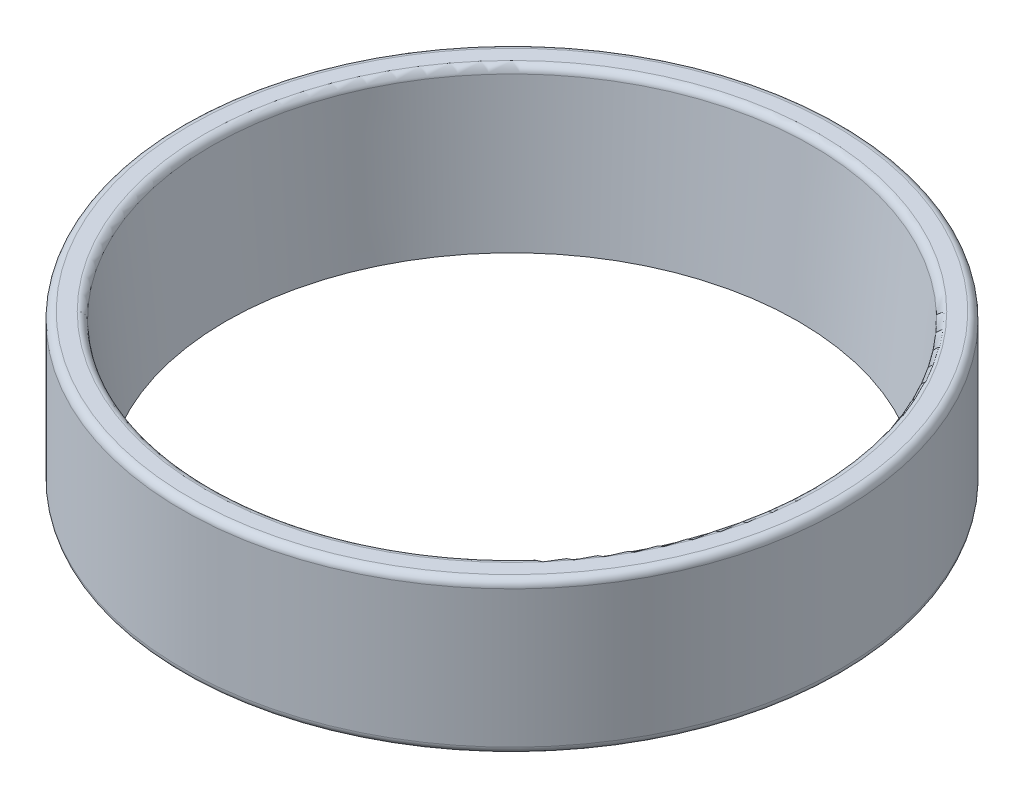
ISO-10303-21;
HEADER;
FILE_DESCRIPTION(('STEP AP214'),'2;1');
FILE_NAME('part.step','',(''),(''),'','','');
FILE_SCHEMA(('AUTOMOTIVE_DESIGN { 1 0 10303 214 1 1 1 1 }'));
ENDSEC;
DATA;
#1=APPLICATION_CONTEXT('core data for automotive mechanical design processes');
#2=APPLICATION_PROTOCOL_DEFINITION('international standard','automotive_design',2000,#1);
#3=PRODUCT_CONTEXT('',#1,'mechanical');
#4=PRODUCT('Part','Part','',(#3));
#5=PRODUCT_RELATED_PRODUCT_CATEGORY('part','',(#4));
#6=PRODUCT_DEFINITION_FORMATION('','',#4);
#7=PRODUCT_DEFINITION_CONTEXT('part definition',#1,'design');
#8=PRODUCT_DEFINITION('design','',#6,#7);
#9=PRODUCT_DEFINITION_SHAPE('','',#8);
#10=(LENGTH_UNIT() NAMED_UNIT(*) SI_UNIT(.MILLI.,.METRE.));
#11=(NAMED_UNIT(*) PLANE_ANGLE_UNIT() SI_UNIT($,.RADIAN.));
#12=(NAMED_UNIT(*) SI_UNIT($,.STERADIAN.) SOLID_ANGLE_UNIT());
#13=UNCERTAINTY_MEASURE_WITH_UNIT(LENGTH_MEASURE(1.E-05),#10,'distance_accuracy_value','');
#14=(GEOMETRIC_REPRESENTATION_CONTEXT(3) GLOBAL_UNCERTAINTY_ASSIGNED_CONTEXT((#13)) GLOBAL_UNIT_ASSIGNED_CONTEXT((#10,
#11,#12)) REPRESENTATION_CONTEXT('',''));
#15=CARTESIAN_POINT('',(0.,0.,0.));
#16=DIRECTION('',(0.,0.,1.));
#17=DIRECTION('',(1.,0.,0.));
#18=AXIS2_PLACEMENT_3D('',#15,#16,#17);
#19=CARTESIAN_POINT('',(-4.44089209850063E-13,15.185817227761,-4.44089209850063E-13));
#20=DIRECTION('',(0.,0.999999999999999,0.));
#21=DIRECTION('',(-1.,0.,0.));
#22=AXIS2_PLACEMENT_3D('',#19,#20,#21);
#23=CONICAL_SURFACE('',#22,31.429838453865,0.0957067080868045);
#24=CARTESIAN_POINT('',(-4.44089209850063E-13,15.185817227761,-4.44089209850063E-13));
#25=DIRECTION('',(0.,0.999999999999999,0.));
#26=DIRECTION('',(-1.,0.,0.));
#27=AXIS2_PLACEMENT_3D('',#24,#25,#26);
#28=CIRCLE('',#27,31.429838453865);
#29=CARTESIAN_POINT('',(-31.4298384538655,15.185817227761,-4.32094352555405E-13));
#30=VERTEX_POINT('',#29);
#31=EDGE_CURVE('E187',#30,#30,#28,.F.);
#32=CARTESIAN_POINT('',(0.,0.,0.));
#33=DIRECTION('',(0.,0.999999999999999,0.));
#34=DIRECTION('',(-1.,0.,0.));
#35=AXIS2_PLACEMENT_3D('',#32,#33,#34);
#36=CIRCLE('',#35,29.972);
#37=CARTESIAN_POINT('',(-29.9720000000005,0.,-4.32650720805228E-13));
#38=VERTEX_POINT('',#37);
#39=EDGE_CURVE('E62',#38,#38,#36,.T.);
#40=CARTESIAN_POINT('',(-31.4298384538655,15.185817227761,-4.32094352555405E-13));
#41=CARTESIAN_POINT('',(-31.4146526366378,15.0276316316385,-4.32100148058008E-13));
#42=CARTESIAN_POINT('',(-31.39946681941,14.869446035516,-4.3210594356061E-13));
#43=CARTESIAN_POINT('',(-31.3690951849545,14.553074843271,-4.32117534565815E-13));
#44=CARTESIAN_POINT('',(-31.3539093677267,14.3948892471485,-4.32123330068417E-13));
#45=CARTESIAN_POINT('',(-31.3235377332712,14.0785180549035,-4.32134921073622E-13));
#46=CARTESIAN_POINT('',(-31.3083519160434,13.9203324587809,-4.32140716576224E-13));
#47=CARTESIAN_POINT('',(-31.2779802815879,13.6039612665359,-4.32152307581429E-13));
#48=CARTESIAN_POINT('',(-31.2627944643602,13.4457756704134,-4.32158103084031E-13));
#49=CARTESIAN_POINT('',(-31.2324228299046,13.1294044781684,-4.32169694089235E-13));
#50=CARTESIAN_POINT('',(-31.2172370126769,12.9712188820459,-4.32175489591838E-13));
#51=CARTESIAN_POINT('',(-31.1868653782214,12.6548476898009,-4.32187080597042E-13));
#52=CARTESIAN_POINT('',(-31.1716795609936,12.4966620936783,-4.32192876099645E-13));
#53=CARTESIAN_POINT('',(-31.1413079265381,12.1802909014333,-4.32204467104849E-13));
#54=CARTESIAN_POINT('',(-31.1261221093103,12.0221053053108,-4.32210262607452E-13));
#55=CARTESIAN_POINT('',(-31.0957504748548,11.7057341130658,-4.32221853612656E-13));
#56=CARTESIAN_POINT('',(-31.080564657627,11.5475485169433,-4.32227649115259E-13));
#57=CARTESIAN_POINT('',(-31.0501930231715,11.2311773246983,-4.32239240120463E-13));
#58=CARTESIAN_POINT('',(-31.0350072059437,11.0729917285757,-4.32245035623066E-13));
#59=CARTESIAN_POINT('',(-31.0046355714882,10.7566205363307,-4.3225662662827E-13));
#60=CARTESIAN_POINT('',(-30.9894497542605,10.5984349402082,-4.32262422130873E-13));
#61=CARTESIAN_POINT('',(-30.9590781198049,10.2820637479632,-4.32274013136077E-13));
#62=CARTESIAN_POINT('',(-30.9438923025772,10.1238781518407,-4.3227980863868E-13));
#63=CARTESIAN_POINT('',(-30.9135206681216,9.80750695959566,-4.32291399643884E-13));
#64=CARTESIAN_POINT('',(-30.8983348508939,9.64932136347315,-4.32297195146486E-13));
#65=CARTESIAN_POINT('',(-30.8679632164384,9.33295017122813,-4.32308786151691E-13));
#66=CARTESIAN_POINT('',(-30.8527773992106,9.17476457510562,-4.32314581654293E-13));
#67=CARTESIAN_POINT('',(-30.8224057647551,8.8583933828606,-4.32326172659498E-13));
#68=CARTESIAN_POINT('',(-30.8072199475273,8.70020778673809,-4.323319681621E-13));
#69=CARTESIAN_POINT('',(-30.7768483130718,8.38383659449307,-4.32343559167305E-13));
#70=CARTESIAN_POINT('',(-30.761662495844,8.22565099837056,-4.32349354669907E-13));
#71=CARTESIAN_POINT('',(-30.7312908613885,7.90927980612554,-4.32360945675112E-13));
#72=CARTESIAN_POINT('',(-30.7161050441608,7.75109421000303,-4.32366741177714E-13));
#73=CARTESIAN_POINT('',(-30.6857334097052,7.434723017758,-4.32378332182919E-13));
#74=CARTESIAN_POINT('',(-30.6705475924775,7.27653742163549,-4.32384127685521E-13));
#75=CARTESIAN_POINT('',(-30.6401759580219,6.96016622939047,-4.32395718690726E-13));
#76=CARTESIAN_POINT('',(-30.6249901407942,6.80198063326796,-4.32401514193328E-13));
#77=CARTESIAN_POINT('',(-30.5946185063387,6.48560944102294,-4.32413105198533E-13));
#78=CARTESIAN_POINT('',(-30.5794326891109,6.32742384490043,-4.32418900701135E-13));
#79=CARTESIAN_POINT('',(-30.5490610546554,6.01105265265541,-4.3243049170634E-13));
#80=CARTESIAN_POINT('',(-30.5338752374276,5.8528670565329,-4.32436287208942E-13));
#81=CARTESIAN_POINT('',(-30.5035036029721,5.53649586428787,-4.32447878214147E-13));
#82=CARTESIAN_POINT('',(-30.4883177857443,5.37831026816536,-4.32453673716749E-13));
#83=CARTESIAN_POINT('',(-30.4579461512888,5.06193907592034,-4.32465264721954E-13));
#84=CARTESIAN_POINT('',(-30.4427603340611,4.90375347979783,-4.32471060224556E-13));
#85=CARTESIAN_POINT('',(-30.4123886996055,4.58738228755281,-4.32482651229761E-13));
#86=CARTESIAN_POINT('',(-30.3972028823778,4.4291966914303,-4.32488446732363E-13));
#87=CARTESIAN_POINT('',(-30.3668312479222,4.11282549918528,-4.32500037737567E-13));
#88=CARTESIAN_POINT('',(-30.3516454306945,3.95463990306277,-4.3250583324017E-13));
#89=CARTESIAN_POINT('',(-30.321273796239,3.63826871081775,-4.32517424245374E-13));
#90=CARTESIAN_POINT('',(-30.3060879790112,3.48008311469524,-4.32523219747977E-13));
#91=CARTESIAN_POINT('',(-30.2757163445557,3.16371192245022,-4.32534810753181E-13));
#92=CARTESIAN_POINT('',(-30.2605305273279,3.00552632632771,-4.32540606255784E-13));
#93=CARTESIAN_POINT('',(-30.2301588928724,2.68915513408268,-4.32552197260988E-13));
#94=CARTESIAN_POINT('',(-30.2149730756446,2.53096953796017,-4.32557992763591E-13));
#95=CARTESIAN_POINT('',(-30.1846014411891,2.21459834571515,-4.32569583768795E-13));
#96=CARTESIAN_POINT('',(-30.1694156239614,2.05641274959264,-4.32575379271398E-13));
#97=CARTESIAN_POINT('',(-30.1390439895058,1.74004155734762,-4.32586970276602E-13));
#98=CARTESIAN_POINT('',(-30.1238581722781,1.58185596122511,-4.32592765779205E-13));
#99=CARTESIAN_POINT('',(-30.0934865378225,1.26548476898009,-4.32604356784409E-13));
#100=CARTESIAN_POINT('',(-30.0783007205948,1.10729917285757,-4.32610152287012E-13));
#101=CARTESIAN_POINT('',(-30.0479290861393,0.790927980612554,-4.32621743292216E-13));
#102=CARTESIAN_POINT('',(-30.0327432689115,0.632742384490044,-4.32627538794819E-13));
#103=CARTESIAN_POINT('',(-30.002371634456,0.316371192245023,-4.32639129800023E-13));
#104=CARTESIAN_POINT('',(-29.9871858172282,0.158185596122512,-4.32644925302625E-13));
#105=CARTESIAN_POINT('',(-29.9720000000005,0.,-4.32650720805228E-13));
#106=B_SPLINE_CURVE_WITH_KNOTS('',3,(#40,#41,#42,#43,#44,#45,#46,#47,#48,#49,#50,#51,#52,#53,
#54,#55,#56,#57,#58,#59,#60,#61,#62,#63,#64,#65,#66,#67,#68,#69,#70,#71,#72,#73,#74,#75,#76,#77,
#78,#79,#80,#81,#82,#83,#84,#85,#86,#87,#88,#89,#90,#91,#92,#93,#94,#95,#96,#97,#98,#99,#100,
#101,#102,#103,#104,#105),.UNSPECIFIED.,.F.,.F.,(4,2,2,2,2,2,2,2,2,2,2,2,2,2,2,2,2,2,2,2,2,2,2,
2,2,2,2,2,2,2,2,2,4),(0.,0.476738530842202,0.953477061684404,1.43021559252661,1.90695412336881,
2.38369265421101,2.86043118505321,3.33716971589541,3.81390824673762,4.29064677757982,
4.76738530842202,5.24412383926422,5.72086237010642,6.19760090094863,6.67433943179083,
7.15107796263303,7.62781649347523,8.10455502431743,8.58129355515964,9.05803208600184,
9.53477061684404,10.0115091476862,10.4882476785284,10.9649862093707,11.4417247402129,
11.9184632710551,12.3952018018973,12.8719403327395,13.3486788635817,13.8254173944239,
14.3021559252661,14.7788944561083,15.2556329869505),.UNSPECIFIED.);
#107=EDGE_CURVE('BSEAM17',#30,#38,#106,.T.);
#108=ORIENTED_EDGE('',*,*,#31,.F.);
#109=ORIENTED_EDGE('',*,*,#39,.F.);
#110=ORIENTED_EDGE('',*,*,#107,.T.);
#111=ORIENTED_EDGE('',*,*,#107,.F.);
#112=EDGE_LOOP('',(#108,#110,#109,#111));
#113=FACE_BOUND('',#112,.T.);
#114=ADVANCED_FACE('F17',(#113),#23,.F.);
#115=CARTESIAN_POINT('',(0.,15.1129999999997,4.44089209850063E-13));
#116=DIRECTION('',(0.,0.999999999999999,0.));
#117=DIRECTION('',(-1.,0.,0.));
#118=AXIS2_PLACEMENT_3D('',#115,#116,#117);
#119=TOROIDAL_SURFACE('',#118,32.188351243039,0.762);
#120=ORIENTED_EDGE('',*,*,#31,.T.);
#121=EDGE_LOOP('',(#120));
#122=FACE_BOUND('',#121,.T.);
#123=CARTESIAN_POINT('',(0.,15.8749999999997,4.44089209850063E-13));
#124=DIRECTION('',(0.,0.999999999999999,0.));
#125=DIRECTION('',(-1.,0.,0.));
#126=AXIS2_PLACEMENT_3D('',#123,#124,#125);
#127=CIRCLE('',#126,32.188351243039);
#128=CARTESIAN_POINT('',(32.1883512430401,15.875,-1.11022302462516E-13));
#129=VERTEX_POINT('',#128);
#130=CARTESIAN_POINT('',(-32.1883512430394,15.8749999999996,2.22044604925031E-13));
#131=VERTEX_POINT('',#130);
#132=EDGE_CURVE('E52',#129,#131,#127,.F.);
#133=ORIENTED_EDGE('',*,*,#132,.F.);
#134=CARTESIAN_POINT('',(0.,15.8749999999997,4.44089209850063E-13));
#135=DIRECTION('',(0.,0.999999999999999,0.));
#136=DIRECTION('',(1.,0.,0.));
#137=AXIS2_PLACEMENT_3D('',#134,#135,#136);
#138=CIRCLE('',#137,32.188351243039);
#139=EDGE_CURVE('E50',#131,#129,#138,.F.);
#140=ORIENTED_EDGE('',*,*,#139,.F.);
#141=EDGE_LOOP('',(#133,#140));
#142=FACE_BOUND('',#141,.T.);
#143=ADVANCED_FACE('F54',(#122,#142),#119,.T.);
#144=CARTESIAN_POINT('',(-34.5058999999999,-1.11022302462516E-13,4.44089209850063E-13));
#145=DIRECTION('',(0.,-0.999999999999999,0.));
#146=DIRECTION('',(1.,0.,0.));
#147=AXIS2_PLACEMENT_3D('',#144,#145,#146);
#148=PLANE('',#147);
#149=ORIENTED_EDGE('',*,*,#39,.T.);
#150=EDGE_LOOP('',(#149));
#151=FACE_BOUND('',#150,.T.);
#152=CARTESIAN_POINT('',(-4.44173808844539E-13,-1.76724954115137E-13,0.));
#153=DIRECTION('',(0.,0.999999999999999,0.));
#154=DIRECTION('',(-1.,0.,0.));
#155=AXIS2_PLACEMENT_3D('',#152,#153,#154);
#156=CIRCLE('',#155,33.7439000000006);
#157=CARTESIAN_POINT('',(-33.7439000000004,-1.11022302462516E-13,3.33066907387547E-13));
#158=VERTEX_POINT('',#157);
#159=CARTESIAN_POINT('',(33.7439000000002,-2.22044604925031E-13,1.11022302462516E-13));
#160=VERTEX_POINT('',#159);
#161=EDGE_CURVE('E149',#158,#160,#156,.T.);
#162=ORIENTED_EDGE('',*,*,#161,.F.);
#163=CARTESIAN_POINT('',(-4.44173808844539E-13,-1.78893358460108E-13,0.));
#164=DIRECTION('',(0.,0.999999999999999,0.));
#165=DIRECTION('',(1.,0.,0.));
#166=AXIS2_PLACEMENT_3D('',#163,#164,#165);
#167=CIRCLE('',#166,33.7439000000006);
#168=EDGE_CURVE('E57',#160,#158,#167,.T.);
#169=ORIENTED_EDGE('',*,*,#168,.F.);
#170=EDGE_LOOP('',(#162,#169));
#171=FACE_BOUND('',#170,.T.);
#172=ADVANCED_FACE('F81',(#151,#171),#148,.T.);
#173=CARTESIAN_POINT('',(-34.5058999999999,15.8750000000001,4.44089209850063E-13));
#174=DIRECTION('',(0.,0.999999999999999,0.));
#175=DIRECTION('',(-1.,0.,0.));
#176=AXIS2_PLACEMENT_3D('',#173,#174,#175);
#177=PLANE('',#176);
#178=CARTESIAN_POINT('',(0.,15.8749999999999,4.44089209850063E-13));
#179=DIRECTION('',(0.,-0.999999999999999,0.));
#180=DIRECTION('',(1.,0.,0.));
#181=AXIS2_PLACEMENT_3D('',#178,#179,#180);
#182=CIRCLE('',#181,33.7438999999999);
#183=CARTESIAN_POINT('',(33.7439000000002,15.8750000000001,3.33066907387547E-13));
#184=VERTEX_POINT('',#183);
#185=CARTESIAN_POINT('',(-33.7439000000004,15.8750000000002,3.33066907387547E-13));
#186=VERTEX_POINT('',#185);
#187=EDGE_CURVE('E110',#184,#186,#182,.T.);
#188=ORIENTED_EDGE('',*,*,#187,.F.);
#189=CARTESIAN_POINT('',(0.,15.8749999999999,4.44089209850063E-13));
#190=DIRECTION('',(0.,-0.999999999999999,0.));
#191=DIRECTION('',(-1.,0.,0.));
#192=AXIS2_PLACEMENT_3D('',#189,#190,#191);
#193=CIRCLE('',#192,33.7438999999999);
#194=EDGE_CURVE('E35',#186,#184,#193,.T.);
#195=ORIENTED_EDGE('',*,*,#194,.F.);
#196=EDGE_LOOP('',(#188,#195));
#197=FACE_BOUND('',#196,.T.);
#198=ORIENTED_EDGE('',*,*,#139,.T.);
#199=ORIENTED_EDGE('',*,*,#132,.T.);
#200=EDGE_LOOP('',(#198,#199));
#201=FACE_BOUND('',#200,.T.);
#202=ADVANCED_FACE('F61',(#197,#201),#177,.T.);
#203=CARTESIAN_POINT('',(-4.44089209850063E-13,0.761999999999822,0.));
#204=DIRECTION('',(0.,-0.999999999999999,0.));
#205=DIRECTION('',(1.,0.,0.));
#206=AXIS2_PLACEMENT_3D('',#203,#204,#205);
#207=TOROIDAL_SURFACE('',#206,33.7439000000006,0.762);
#208=ORIENTED_EDGE('',*,*,#168,.T.);
#209=ORIENTED_EDGE('',*,*,#161,.T.);
#210=EDGE_LOOP('',(#208,#209));
#211=FACE_BOUND('',#210,.T.);
#212=CARTESIAN_POINT('',(-4.44089209850063E-13,0.761999999999707,0.));
#213=DIRECTION('',(0.,0.999999999999999,0.));
#214=DIRECTION('',(-1.,0.,0.));
#215=AXIS2_PLACEMENT_3D('',#212,#213,#214);
#216=CIRCLE('',#215,34.5059);
#217=CARTESIAN_POINT('',(-34.5059000000001,0.761999999999707,-4.30920406996327E-13));
#218=VERTEX_POINT('',#217);
#219=EDGE_CURVE('E27',#218,#218,#216,.T.);
#220=ORIENTED_EDGE('',*,*,#219,.F.);
#221=EDGE_LOOP('',(#220));
#222=FACE_BOUND('',#221,.T.);
#223=ADVANCED_FACE('F80',(#211,#222),#207,.T.);
#224=CARTESIAN_POINT('',(0.,15.1129999999999,4.44089209850063E-13));
#225=DIRECTION('',(0.,0.999999999999999,0.));
#226=DIRECTION('',(-1.,0.,0.));
#227=AXIS2_PLACEMENT_3D('',#224,#225,#226);
#228=TOROIDAL_SURFACE('',#227,33.7438999999999,0.762);
#229=ORIENTED_EDGE('',*,*,#194,.T.);
#230=ORIENTED_EDGE('',*,*,#187,.T.);
#231=EDGE_LOOP('',(#229,#230));
#232=FACE_BOUND('',#231,.T.);
#233=CARTESIAN_POINT('',(0.,15.1130000000002,4.44089209850063E-13));
#234=DIRECTION('',(0.,0.999999999999999,0.));
#235=DIRECTION('',(-1.,0.,0.));
#236=AXIS2_PLACEMENT_3D('',#233,#234,#235);
#237=CIRCLE('',#236,34.5059);
#238=CARTESIAN_POINT('',(-34.5059000000001,15.1130000000002,-4.30920406996327E-13));
#239=VERTEX_POINT('',#238);
#240=EDGE_CURVE('E11',#239,#239,#237,.F.);
#241=ORIENTED_EDGE('',*,*,#240,.F.);
#242=EDGE_LOOP('',(#241));
#243=FACE_BOUND('',#242,.T.);
#244=ADVANCED_FACE('F114',(#232,#243),#228,.T.);
#245=CARTESIAN_POINT('',(0.,84.037025316455,-4.44089209850063E-13));
#246=DIRECTION('',(0.,0.999999999999999,0.));
#247=DIRECTION('',(-1.,0.,0.));
#248=AXIS2_PLACEMENT_3D('',#245,#246,#247);
#249=CYLINDRICAL_SURFACE('',#248,34.5059);
#250=CARTESIAN_POINT('',(-34.5059000000001,15.1130000000002,-4.30920406996327E-13));
#251=CARTESIAN_POINT('',(-34.5059000000001,14.9635104166668,-4.30920406996327E-13));
#252=CARTESIAN_POINT('',(-34.5059000000001,14.8140208333335,-4.30920406996327E-13));
#253=CARTESIAN_POINT('',(-34.5059000000001,14.5150416666668,-4.30920406996327E-13));
#254=CARTESIAN_POINT('',(-34.5059000000001,14.3655520833335,-4.30920406996327E-13));
#255=CARTESIAN_POINT('',(-34.5059000000001,14.0665729166668,-4.30920406996327E-13));
#256=CARTESIAN_POINT('',(-34.5059000000001,13.9170833333335,-4.30920406996327E-13));
#257=CARTESIAN_POINT('',(-34.5059000000001,13.6181041666668,-4.30920406996327E-13));
#258=CARTESIAN_POINT('',(-34.5059000000001,13.4686145833334,-4.30920406996327E-13));
#259=CARTESIAN_POINT('',(-34.5059000000001,13.1696354166668,-4.30920406996327E-13));
#260=CARTESIAN_POINT('',(-34.5059000000001,13.0201458333334,-4.30920406996327E-13));
#261=CARTESIAN_POINT('',(-34.5059000000001,12.7211666666668,-4.30920406996327E-13));
#262=CARTESIAN_POINT('',(-34.5059000000001,12.5716770833334,-4.30920406996327E-13));
#263=CARTESIAN_POINT('',(-34.5059000000001,12.2726979166667,-4.30920406996327E-13));
#264=CARTESIAN_POINT('',(-34.5059000000001,12.1232083333334,-4.30920406996327E-13));
#265=CARTESIAN_POINT('',(-34.5059000000001,11.8242291666667,-4.30920406996327E-13));
#266=CARTESIAN_POINT('',(-34.5059000000001,11.6747395833334,-4.30920406996327E-13));
#267=CARTESIAN_POINT('',(-34.5059000000001,11.3757604166667,-4.30920406996327E-13));
#268=CARTESIAN_POINT('',(-34.5059000000001,11.2262708333334,-4.30920406996327E-13));
#269=CARTESIAN_POINT('',(-34.5059000000001,10.9272916666667,-4.30920406996327E-13));
#270=CARTESIAN_POINT('',(-34.5059000000001,10.7778020833334,-4.30920406996327E-13));
#271=CARTESIAN_POINT('',(-34.5059000000001,10.4788229166667,-4.30920406996327E-13));
#272=CARTESIAN_POINT('',(-34.5059000000001,10.3293333333333,-4.30920406996327E-13));
#273=CARTESIAN_POINT('',(-34.5059000000001,10.0303541666667,-4.30920406996327E-13));
#274=CARTESIAN_POINT('',(-34.5059000000001,9.88086458333332,-4.30920406996327E-13));
#275=CARTESIAN_POINT('',(-34.5059000000001,9.58188541666665,-4.30920406996327E-13));
#276=CARTESIAN_POINT('',(-34.5059000000001,9.43239583333331,-4.30920406996327E-13));
#277=CARTESIAN_POINT('',(-34.5059000000001,9.13341666666664,-4.30920406996327E-13));
#278=CARTESIAN_POINT('',(-34.5059000000001,8.9839270833333,-4.30920406996327E-13));
#279=CARTESIAN_POINT('',(-34.5059000000001,8.68494791666662,-4.30920406996327E-13));
#280=CARTESIAN_POINT('',(-34.5059000000001,8.53545833333328,-4.30920406996327E-13));
#281=CARTESIAN_POINT('',(-34.5059000000001,8.23647916666661,-4.30920406996327E-13));
#282=CARTESIAN_POINT('',(-34.5059000000001,8.08698958333327,-4.30920406996327E-13));
#283=CARTESIAN_POINT('',(-34.5059000000001,7.78801041666659,-4.30920406996327E-13));
#284=CARTESIAN_POINT('',(-34.5059000000001,7.63852083333325,-4.30920406996327E-13));
#285=CARTESIAN_POINT('',(-34.5059000000001,7.33954166666658,-4.30920406996327E-13));
#286=CARTESIAN_POINT('',(-34.5059000000001,7.19005208333324,-4.30920406996327E-13));
#287=CARTESIAN_POINT('',(-34.5059000000001,6.89107291666656,-4.30920406996327E-13));
#288=CARTESIAN_POINT('',(-34.5059000000001,6.74158333333323,-4.30920406996327E-13));
#289=CARTESIAN_POINT('',(-34.5059000000001,6.44260416666655,-4.30920406996327E-13));
#290=CARTESIAN_POINT('',(-34.5059000000001,6.29311458333321,-4.30920406996327E-13));
#291=CARTESIAN_POINT('',(-34.5059000000001,5.99413541666654,-4.30920406996327E-13));
#292=CARTESIAN_POINT('',(-34.5059000000001,5.8446458333332,-4.30920406996327E-13));
#293=CARTESIAN_POINT('',(-34.5059000000001,5.54566666666652,-4.30920406996327E-13));
#294=CARTESIAN_POINT('',(-34.5059000000001,5.39617708333319,-4.30920406996327E-13));
#295=CARTESIAN_POINT('',(-34.5059000000001,5.0971979166665,-4.30920406996327E-13));
#296=CARTESIAN_POINT('',(-34.5059000000001,4.94770833333316,-4.30920406996327E-13));
#297=CARTESIAN_POINT('',(-34.5059000000001,4.64872916666648,-4.30920406996327E-13));
#298=CARTESIAN_POINT('',(-34.5059000000001,4.49923958333314,-4.30920406996327E-13));
#299=CARTESIAN_POINT('',(-34.5059000000001,4.20026041666647,-4.30920406996327E-13));
#300=CARTESIAN_POINT('',(-34.5059000000001,4.05077083333313,-4.30920406996327E-13));
#301=CARTESIAN_POINT('',(-34.5059000000001,3.75179166666646,-4.30920406996327E-13));
#302=CARTESIAN_POINT('',(-34.5059000000001,3.60230208333312,-4.30920406996327E-13));
#303=CARTESIAN_POINT('',(-34.5059000000001,3.30332291666645,-4.30920406996327E-13));
#304=CARTESIAN_POINT('',(-34.5059000000001,3.15383333333311,-4.30920406996327E-13));
#305=CARTESIAN_POINT('',(-34.5059000000001,2.85485416666644,-4.30920406996327E-13));
#306=CARTESIAN_POINT('',(-34.5059000000001,2.7053645833331,-4.30920406996327E-13));
#307=CARTESIAN_POINT('',(-34.5059000000001,2.40638541666643,-4.30920406996327E-13));
#308=CARTESIAN_POINT('',(-34.5059000000001,2.25689583333309,-4.30920406996327E-13));
#309=CARTESIAN_POINT('',(-34.5059000000001,1.95791666666641,-4.30920406996327E-13));
#310=CARTESIAN_POINT('',(-34.5059000000001,1.80842708333307,-4.30920406996327E-13));
#311=CARTESIAN_POINT('',(-34.5059000000001,1.5094479166664,-4.30920406996327E-13));
#312=CARTESIAN_POINT('',(-34.5059000000001,1.35995833333306,-4.30920406996327E-13));
#313=CARTESIAN_POINT('',(-34.5059000000001,1.06097916666638,-4.30920406996327E-13));
#314=CARTESIAN_POINT('',(-34.5059000000001,0.911489583333045,-4.30920406996327E-13));
#315=CARTESIAN_POINT('',(-34.5059000000001,0.761999999999707,-4.30920406996327E-13));
#316=B_SPLINE_CURVE_WITH_KNOTS('',3,(#250,#251,#252,#253,#254,#255,#256,#257,#258,#259,#260,
#261,#262,#263,#264,#265,#266,#267,#268,#269,#270,#271,#272,#273,#274,#275,#276,#277,#278,#279,
#280,#281,#282,#283,#284,#285,#286,#287,#288,#289,#290,#291,#292,#293,#294,#295,#296,#297,#298,
#299,#300,#301,#302,#303,#304,#305,#306,#307,#308,#309,#310,#311,#312,#313,#314,#315),
.UNSPECIFIED.,.F.,.F.,(4,2,2,2,2,2,2,2,2,2,2,2,2,2,2,2,2,2,2,2,2,2,2,2,2,2,2,2,2,2,2,2,4),(0.,
0.448468750000014,0.896937500000028,1.34540625000004,1.79387500000006,2.24234375000007,
2.69081250000008,3.1392812500001,3.58775000000011,4.03621875000014,4.48468750000015,
4.93315625000017,5.38162500000018,5.8300937500002,6.27856250000021,6.72703125000022,
7.17550000000024,7.62396875000025,8.07243750000027,8.52090625000028,8.96937500000029,
9.41784375000031,9.86631250000032,10.3147812500003,10.7632500000004,11.2117187500004,
11.6601875000004,12.1086562500004,12.5571250000004,13.0055937500004,13.4540625000004,
13.9025312500004,14.3510000000005),.UNSPECIFIED.);
#317=EDGE_CURVE('BSEAM123',#239,#218,#316,.T.);
#318=ORIENTED_EDGE('',*,*,#240,.T.);
#319=ORIENTED_EDGE('',*,*,#219,.T.);
#320=ORIENTED_EDGE('',*,*,#317,.T.);
#321=ORIENTED_EDGE('',*,*,#317,.F.);
#322=EDGE_LOOP('',(#318,#320,#319,#321));
#323=FACE_BOUND('',#322,.T.);
#324=ADVANCED_FACE('F123',(#323),#249,.T.);
#325=CLOSED_SHELL('',(#114,#143,#172,#202,#223,#244,#324));
#326=MANIFOLD_SOLID_BREP('B1',#325);
#327=ADVANCED_BREP_SHAPE_REPRESENTATION('',(#18,#326),#14);
#328=SHAPE_DEFINITION_REPRESENTATION(#9,#327);
ENDSEC;
END-ISO-10303-21;
